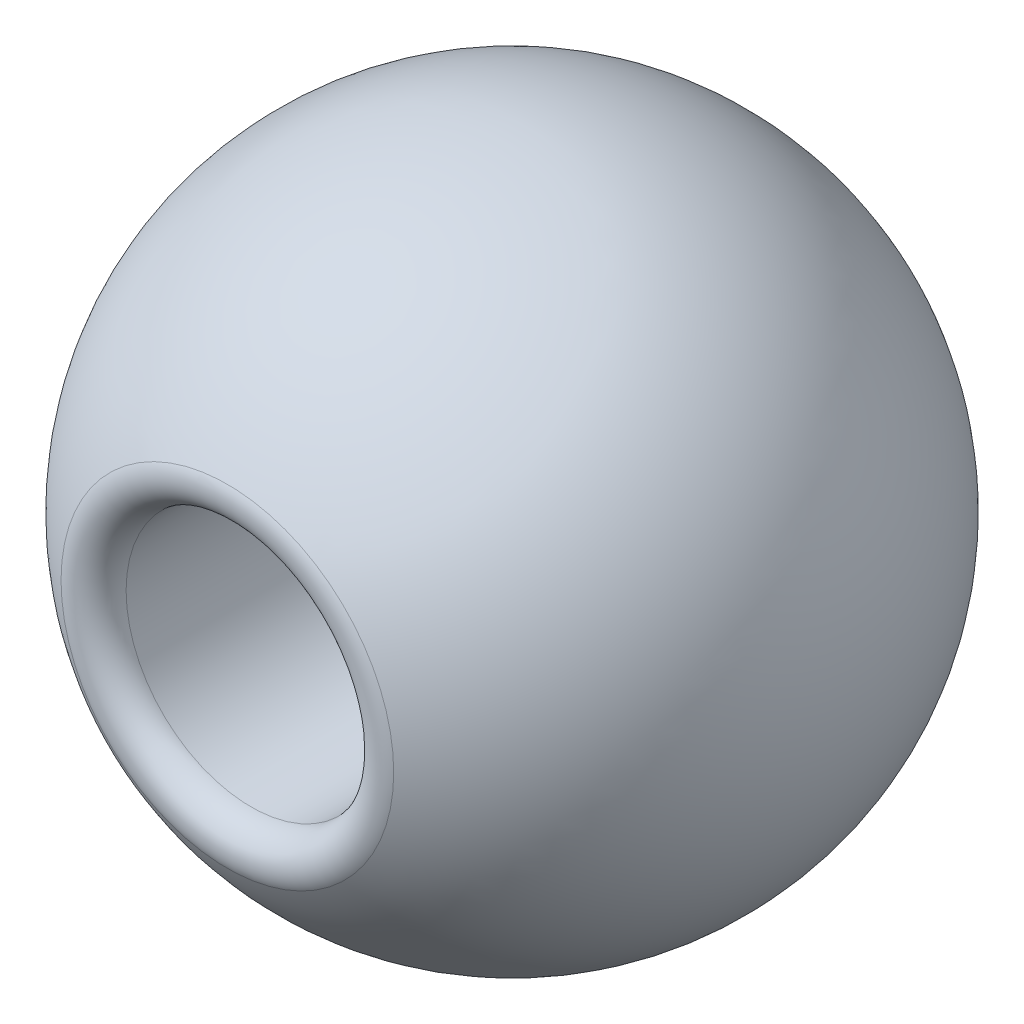
ISO-10303-21;
HEADER;
FILE_DESCRIPTION(('STEP AP214'),'2;1');
FILE_NAME('part.step','',(''),(''),'','','');
FILE_SCHEMA(('AUTOMOTIVE_DESIGN { 1 0 10303 214 1 1 1 1 }'));
ENDSEC;
DATA;
#1=APPLICATION_CONTEXT('core data for automotive mechanical design processes');
#2=APPLICATION_PROTOCOL_DEFINITION('international standard','automotive_design',2000,#1);
#3=PRODUCT_CONTEXT('',#1,'mechanical');
#4=PRODUCT('Part','Part','',(#3));
#5=PRODUCT_RELATED_PRODUCT_CATEGORY('part','',(#4));
#6=PRODUCT_DEFINITION_FORMATION('','',#4);
#7=PRODUCT_DEFINITION_CONTEXT('part definition',#1,'design');
#8=PRODUCT_DEFINITION('design','',#6,#7);
#9=PRODUCT_DEFINITION_SHAPE('','',#8);
#10=(LENGTH_UNIT() NAMED_UNIT(*) SI_UNIT(.MILLI.,.METRE.));
#11=(NAMED_UNIT(*) PLANE_ANGLE_UNIT() SI_UNIT($,.RADIAN.));
#12=(NAMED_UNIT(*) SI_UNIT($,.STERADIAN.) SOLID_ANGLE_UNIT());
#13=UNCERTAINTY_MEASURE_WITH_UNIT(LENGTH_MEASURE(1.E-05),#10,'distance_accuracy_value','');
#14=(GEOMETRIC_REPRESENTATION_CONTEXT(3) GLOBAL_UNCERTAINTY_ASSIGNED_CONTEXT((#13)) GLOBAL_UNIT_ASSIGNED_CONTEXT((#10,
#11,#12)) REPRESENTATION_CONTEXT('',''));
#15=CARTESIAN_POINT('',(0.,0.,0.));
#16=DIRECTION('',(0.,0.,1.));
#17=DIRECTION('',(1.,0.,0.));
#18=AXIS2_PLACEMENT_3D('',#15,#16,#17);
#19=CARTESIAN_POINT('',(0.,0.,0.));
#20=DIRECTION('',(0.,1.,0.));
#21=DIRECTION('',(1.,0.,0.));
#22=AXIS2_PLACEMENT_3D('',#19,#20,#21);
#23=SPHERICAL_SURFACE('',#22,12.);
#24=CARTESIAN_POINT('',(0.,0.,0.));
#25=DIRECTION('',(0.,0.,1.));
#26=DIRECTION('',(1.,0.,0.));
#27=AXIS2_PLACEMENT_3D('',#24,#25,#26);
#28=SPHERICAL_SURFACE('',#27,12.);
#29=CARTESIAN_POINT('',(0.,0.,-10.3606215710662));
#30=DIRECTION('',(0.,0.,1.));
#31=DIRECTION('',(1.,0.,0.));
#32=AXIS2_PLACEMENT_3D('',#29,#30,#31);
#33=CIRCLE('',#32,6.05454545454545);
#34=CARTESIAN_POINT('',(6.05454545454545,0.,-10.3606215710662));
#35=VERTEX_POINT('',#34);
#36=EDGE_CURVE('E10',#35,#35,#33,.T.);
#37=ORIENTED_EDGE('',*,*,#36,.T.);
#38=EDGE_LOOP('',(#37));
#39=FACE_BOUND('',#38,.T.);
#40=CARTESIAN_POINT('',(0.,0.,10.3606215710662));
#41=DIRECTION('',(0.,0.,-1.));
#42=DIRECTION('',(-1.,0.,0.));
#43=AXIS2_PLACEMENT_3D('',#40,#41,#42);
#44=CIRCLE('',#43,6.05454545454545);
#45=CARTESIAN_POINT('',(-6.05454545454545,0.,10.3606215710662));
#46=VERTEX_POINT('',#45);
#47=EDGE_CURVE('E37',#46,#46,#44,.T.);
#48=ORIENTED_EDGE('',*,*,#47,.T.);
#49=EDGE_LOOP('',(#48));
#50=FACE_BOUND('',#49,.T.);
#51=ADVANCED_FACE('F30',(#39,#50),#28,.T.);
#52=CARTESIAN_POINT('',(0.,0.,-15.));
#53=DIRECTION('',(0.,0.,1.));
#54=DIRECTION('',(1.,0.,0.));
#55=AXIS2_PLACEMENT_3D('',#52,#53,#54);
#56=CYLINDRICAL_SURFACE('',#55,4.55);
#57=CARTESIAN_POINT('',(0.,0.,-9.49723644014405));
#58=DIRECTION('',(0.,0.,1.));
#59=DIRECTION('',(1.,0.,0.));
#60=AXIS2_PLACEMENT_3D('',#57,#58,#59);
#61=CIRCLE('',#60,4.55);
#62=CARTESIAN_POINT('',(4.55,0.,-9.49723644014405));
#63=VERTEX_POINT('',#62);
#64=EDGE_CURVE('E41',#63,#63,#61,.F.);
#65=ORIENTED_EDGE('',*,*,#64,.T.);
#66=EDGE_LOOP('',(#65));
#67=FACE_BOUND('',#66,.T.);
#68=CARTESIAN_POINT('',(0.,0.,9.49723644014404));
#69=DIRECTION('',(0.,0.,-1.));
#70=DIRECTION('',(-1.,0.,0.));
#71=AXIS2_PLACEMENT_3D('',#68,#69,#70);
#72=CIRCLE('',#71,4.55);
#73=CARTESIAN_POINT('',(-4.55,0.,9.49723644014404));
#74=VERTEX_POINT('',#73);
#75=EDGE_CURVE('E45',#74,#74,#72,.F.);
#76=ORIENTED_EDGE('',*,*,#75,.T.);
#77=EDGE_LOOP('',(#76));
#78=FACE_BOUND('',#77,.T.);
#79=ADVANCED_FACE('F51',(#67,#78),#56,.F.);
#80=CARTESIAN_POINT('',(0.,0.,-9.49723644014405));
#81=DIRECTION('',(0.,0.,1.));
#82=DIRECTION('',(1.,0.,0.));
#83=AXIS2_PLACEMENT_3D('',#80,#81,#82);
#84=TOROIDAL_SURFACE('',#83,5.55,1.);
#85=ORIENTED_EDGE('',*,*,#36,.F.);
#86=EDGE_LOOP('',(#85));
#87=FACE_BOUND('',#86,.T.);
#88=ORIENTED_EDGE('',*,*,#64,.F.);
#89=EDGE_LOOP('',(#88));
#90=FACE_BOUND('',#89,.T.);
#91=ADVANCED_FACE('F54',(#87,#90),#84,.T.);
#92=CARTESIAN_POINT('',(0.,0.,9.49723644014405));
#93=DIRECTION('',(0.,0.,-1.));
#94=DIRECTION('',(-1.,0.,0.));
#95=AXIS2_PLACEMENT_3D('',#92,#93,#94);
#96=TOROIDAL_SURFACE('',#95,5.55,1.);
#97=ORIENTED_EDGE('',*,*,#47,.F.);
#98=EDGE_LOOP('',(#97));
#99=FACE_BOUND('',#98,.T.);
#100=ORIENTED_EDGE('',*,*,#75,.F.);
#101=EDGE_LOOP('',(#100));
#102=FACE_BOUND('',#101,.T.);
#103=ADVANCED_FACE('F32',(#99,#102),#96,.T.);
#104=CLOSED_SHELL('',(#51,#79,#91,#103));
#105=MANIFOLD_SOLID_BREP('B2',#104);
#106=ADVANCED_BREP_SHAPE_REPRESENTATION('',(#18,#105),#14);
#107=SHAPE_DEFINITION_REPRESENTATION(#9,#106);
ENDSEC;
END-ISO-10303-21;
